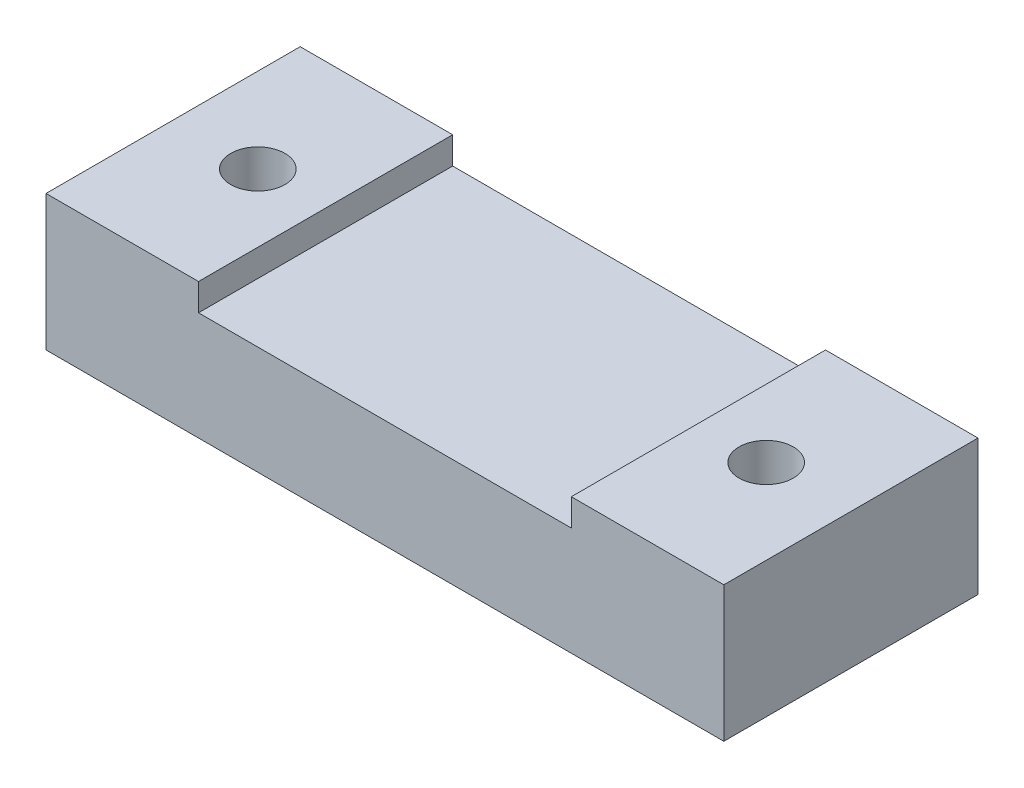
ISO-10303-21;
HEADER;
FILE_DESCRIPTION(('STEP AP214'),'2;1');
FILE_NAME('part.step','',(''),(''),'','','');
FILE_SCHEMA(('AUTOMOTIVE_DESIGN { 1 0 10303 214 1 1 1 1 }'));
ENDSEC;
DATA;
#1=APPLICATION_CONTEXT('core data for automotive mechanical design processes');
#2=APPLICATION_PROTOCOL_DEFINITION('international standard','automotive_design',2000,#1);
#3=PRODUCT_CONTEXT('',#1,'mechanical');
#4=PRODUCT('Part','Part','',(#3));
#5=PRODUCT_RELATED_PRODUCT_CATEGORY('part','',(#4));
#6=PRODUCT_DEFINITION_FORMATION('','',#4);
#7=PRODUCT_DEFINITION_CONTEXT('part definition',#1,'design');
#8=PRODUCT_DEFINITION('design','',#6,#7);
#9=PRODUCT_DEFINITION_SHAPE('','',#8);
#10=(LENGTH_UNIT() NAMED_UNIT(*) SI_UNIT(.MILLI.,.METRE.));
#11=(NAMED_UNIT(*) PLANE_ANGLE_UNIT() SI_UNIT($,.RADIAN.));
#12=(NAMED_UNIT(*) SI_UNIT($,.STERADIAN.) SOLID_ANGLE_UNIT());
#13=UNCERTAINTY_MEASURE_WITH_UNIT(LENGTH_MEASURE(1.E-05),#10,'distance_accuracy_value','');
#14=(GEOMETRIC_REPRESENTATION_CONTEXT(3) GLOBAL_UNCERTAINTY_ASSIGNED_CONTEXT((#13)) GLOBAL_UNIT_ASSIGNED_CONTEXT((#10,
#11,#12)) REPRESENTATION_CONTEXT('',''));
#15=CARTESIAN_POINT('',(0.,0.,0.));
#16=DIRECTION('',(0.,0.,1.));
#17=DIRECTION('',(1.,0.,0.));
#18=AXIS2_PLACEMENT_3D('',#15,#16,#17);
#19=CARTESIAN_POINT('',(-15.,0.,0.));
#20=DIRECTION('',(0.,1.,0.));
#21=DIRECTION('',(0.,0.,1.));
#22=AXIS2_PLACEMENT_3D('',#19,#20,#21);
#23=CYLINDRICAL_SURFACE('',#22,1.6);
#24=CARTESIAN_POINT('',(-15.,8.,0.));
#25=DIRECTION('',(0.,1.,0.));
#26=DIRECTION('',(0.,0.,1.));
#27=AXIS2_PLACEMENT_3D('',#24,#25,#26);
#28=CIRCLE('',#27,1.6);
#29=CARTESIAN_POINT('',(-15.,8.,1.6));
#30=VERTEX_POINT('',#29);
#31=EDGE_CURVE('E304',#30,#30,#28,.T.);
#32=ORIENTED_EDGE('',*,*,#31,.T.);
#33=EDGE_LOOP('',(#32));
#34=FACE_BOUND('',#33,.T.);
#35=CARTESIAN_POINT('',(-15.,3.,0.));
#36=DIRECTION('',(0.,-1.,0.));
#37=DIRECTION('',(0.,0.,-1.));
#38=AXIS2_PLACEMENT_3D('',#35,#36,#37);
#39=CIRCLE('',#38,1.6);
#40=CARTESIAN_POINT('',(-15.,3.,-1.6));
#41=VERTEX_POINT('',#40);
#42=EDGE_CURVE('E224',#41,#41,#39,.F.);
#43=ORIENTED_EDGE('',*,*,#42,.F.);
#44=EDGE_LOOP('',(#43));
#45=FACE_BOUND('',#44,.T.);
#46=ADVANCED_FACE('F36',(#34,#45),#23,.F.);
#47=CARTESIAN_POINT('',(0.,8.,0.));
#48=DIRECTION('',(0.,1.,0.));
#49=DIRECTION('',(0.,0.,1.));
#50=AXIS2_PLACEMENT_3D('',#47,#48,#49);
#51=PLANE('',#50);
#52=DIRECTION('',(0.,0.,-1.));
#53=VECTOR('',#52,1.);
#54=CARTESIAN_POINT('',(11.,8.,-7.5));
#55=LINE('',#54,#53);
#56=CARTESIAN_POINT('',(11.,8.,7.5));
#57=VERTEX_POINT('',#56);
#58=CARTESIAN_POINT('',(11.,8.,-7.5));
#59=VERTEX_POINT('',#58);
#60=EDGE_CURVE('E291',#57,#59,#55,.T.);
#61=ORIENTED_EDGE('',*,*,#60,.F.);
#62=DIRECTION('',(1.,0.,0.));
#63=VECTOR('',#62,1.);
#64=CARTESIAN_POINT('',(-20.,8.,7.5));
#65=LINE('',#64,#63);
#66=CARTESIAN_POINT('',(20.,8.,7.5));
#67=VERTEX_POINT('',#66);
#68=EDGE_CURVE('E320',#57,#67,#65,.T.);
#69=ORIENTED_EDGE('',*,*,#68,.T.);
#70=DIRECTION('',(0.,0.,-1.));
#71=VECTOR('',#70,1.);
#72=CARTESIAN_POINT('',(20.,8.,-7.5));
#73=LINE('',#72,#71);
#74=CARTESIAN_POINT('',(20.,8.,-7.5));
#75=VERTEX_POINT('',#74);
#76=EDGE_CURVE('E310',#67,#75,#73,.T.);
#77=ORIENTED_EDGE('',*,*,#76,.T.);
#78=DIRECTION('',(-1.,0.,0.));
#79=VECTOR('',#78,1.);
#80=CARTESIAN_POINT('',(-20.,8.,-7.5));
#81=LINE('',#80,#79);
#82=EDGE_CURVE('E315',#75,#59,#81,.T.);
#83=ORIENTED_EDGE('',*,*,#82,.T.);
#84=EDGE_LOOP('',(#61,#69,#77,#83));
#85=FACE_BOUND('',#84,.T.);
#86=CARTESIAN_POINT('',(15.,8.,0.));
#87=DIRECTION('',(0.,1.,0.));
#88=DIRECTION('',(0.,0.,1.));
#89=AXIS2_PLACEMENT_3D('',#86,#87,#88);
#90=CIRCLE('',#89,1.6);
#91=CARTESIAN_POINT('',(15.,8.,1.6));
#92=VERTEX_POINT('',#91);
#93=EDGE_CURVE('E296',#92,#92,#90,.T.);
#94=ORIENTED_EDGE('',*,*,#93,.F.);
#95=EDGE_LOOP('',(#94));
#96=FACE_BOUND('',#95,.T.);
#97=ADVANCED_FACE('F362',(#85,#96),#51,.T.);
#98=CARTESIAN_POINT('',(20.,8.,-7.5));
#99=DIRECTION('',(-1.,0.,0.));
#100=DIRECTION('',(0.,0.,1.));
#101=AXIS2_PLACEMENT_3D('',#98,#99,#100);
#102=PLANE('',#101);
#103=DIRECTION('',(0.,0.,-1.));
#104=VECTOR('',#103,1.);
#105=CARTESIAN_POINT('',(20.,0.,-7.5));
#106=LINE('',#105,#104);
#107=CARTESIAN_POINT('',(20.,0.,7.5));
#108=VERTEX_POINT('',#107);
#109=CARTESIAN_POINT('',(20.,0.,-7.5));
#110=VERTEX_POINT('',#109);
#111=EDGE_CURVE('E307',#108,#110,#106,.T.);
#112=ORIENTED_EDGE('',*,*,#111,.T.);
#113=DIRECTION('',(0.,-1.,0.));
#114=VECTOR('',#113,1.);
#115=CARTESIAN_POINT('',(20.,8.,-7.5));
#116=LINE('',#115,#114);
#117=EDGE_CURVE('E11',#75,#110,#116,.T.);
#118=ORIENTED_EDGE('',*,*,#117,.F.);
#119=ORIENTED_EDGE('',*,*,#76,.F.);
#120=DIRECTION('',(0.,-1.,0.));
#121=VECTOR('',#120,1.);
#122=CARTESIAN_POINT('',(20.,8.,7.5));
#123=LINE('',#122,#121);
#124=EDGE_CURVE('E324',#67,#108,#123,.T.);
#125=ORIENTED_EDGE('',*,*,#124,.T.);
#126=EDGE_LOOP('',(#112,#118,#119,#125));
#127=FACE_BOUND('',#126,.T.);
#128=ADVANCED_FACE('F38',(#127),#102,.F.);
#129=CARTESIAN_POINT('',(-20.,8.,-7.5));
#130=DIRECTION('',(0.,0.,1.));
#131=DIRECTION('',(1.,0.,0.));
#132=AXIS2_PLACEMENT_3D('',#129,#130,#131);
#133=PLANE('',#132);
#134=DIRECTION('',(-1.,0.,0.));
#135=VECTOR('',#134,1.);
#136=CARTESIAN_POINT('',(-11.,6.4,-7.5));
#137=LINE('',#136,#135);
#138=CARTESIAN_POINT('',(11.,6.4,-7.5));
#139=VERTEX_POINT('',#138);
#140=CARTESIAN_POINT('',(-11.,6.4,-7.5));
#141=VERTEX_POINT('',#140);
#142=EDGE_CURVE('E280',#139,#141,#137,.T.);
#143=ORIENTED_EDGE('',*,*,#142,.F.);
#144=DIRECTION('',(0.,1.,0.));
#145=VECTOR('',#144,1.);
#146=CARTESIAN_POINT('',(11.,6.4,-7.5));
#147=LINE('',#146,#145);
#148=EDGE_CURVE('E290',#139,#59,#147,.T.);
#149=ORIENTED_EDGE('',*,*,#148,.T.);
#150=ORIENTED_EDGE('',*,*,#82,.F.);
#151=ORIENTED_EDGE('',*,*,#117,.T.);
#152=DIRECTION('',(-1.,0.,0.));
#153=VECTOR('',#152,1.);
#154=CARTESIAN_POINT('',(-20.,0.,-7.5));
#155=LINE('',#154,#153);
#156=CARTESIAN_POINT('',(-20.,0.,-7.5));
#157=VERTEX_POINT('',#156);
#158=EDGE_CURVE('E327',#110,#157,#155,.T.);
#159=ORIENTED_EDGE('',*,*,#158,.T.);
#160=DIRECTION('',(0.,-1.,0.));
#161=VECTOR('',#160,1.);
#162=CARTESIAN_POINT('',(-20.,8.,-7.5));
#163=LINE('',#162,#161);
#164=CARTESIAN_POINT('',(-20.,8.,-7.5));
#165=VERTEX_POINT('',#164);
#166=EDGE_CURVE('E45',#165,#157,#163,.T.);
#167=ORIENTED_EDGE('',*,*,#166,.F.);
#168=CARTESIAN_POINT('',(-11.,8.,-7.5));
#169=VERTEX_POINT('',#168);
#170=EDGE_CURVE('E313',#169,#165,#81,.T.);
#171=ORIENTED_EDGE('',*,*,#170,.F.);
#172=DIRECTION('',(0.,1.,0.));
#173=VECTOR('',#172,1.);
#174=CARTESIAN_POINT('',(-11.,6.4,-7.5));
#175=LINE('',#174,#173);
#176=EDGE_CURVE('E300',#141,#169,#175,.T.);
#177=ORIENTED_EDGE('',*,*,#176,.F.);
#178=EDGE_LOOP('',(#143,#149,#150,#151,#159,#167,#171,#177));
#179=FACE_BOUND('',#178,.T.);
#180=ADVANCED_FACE('F390',(#179),#133,.F.);
#181=CARTESIAN_POINT('',(-20.,8.,-7.5));
#182=DIRECTION('',(1.,0.,0.));
#183=DIRECTION('',(0.,0.,-1.));
#184=AXIS2_PLACEMENT_3D('',#181,#182,#183);
#185=PLANE('',#184);
#186=DIRECTION('',(0.,0.,1.));
#187=VECTOR('',#186,1.);
#188=CARTESIAN_POINT('',(-20.,0.,-7.5));
#189=LINE('',#188,#187);
#190=CARTESIAN_POINT('',(-20.,0.,7.5));
#191=VERTEX_POINT('',#190);
#192=EDGE_CURVE('E329',#157,#191,#189,.T.);
#193=ORIENTED_EDGE('',*,*,#192,.T.);
#194=DIRECTION('',(0.,-1.,0.));
#195=VECTOR('',#194,1.);
#196=CARTESIAN_POINT('',(-20.,8.,7.5));
#197=LINE('',#196,#195);
#198=CARTESIAN_POINT('',(-20.,8.,7.5));
#199=VERTEX_POINT('',#198);
#200=EDGE_CURVE('E334',#199,#191,#197,.T.);
#201=ORIENTED_EDGE('',*,*,#200,.F.);
#202=DIRECTION('',(0.,0.,1.));
#203=VECTOR('',#202,1.);
#204=CARTESIAN_POINT('',(-20.,8.,-7.5));
#205=LINE('',#204,#203);
#206=EDGE_CURVE('E318',#165,#199,#205,.T.);
#207=ORIENTED_EDGE('',*,*,#206,.F.);
#208=ORIENTED_EDGE('',*,*,#166,.T.);
#209=EDGE_LOOP('',(#193,#201,#207,#208));
#210=FACE_BOUND('',#209,.T.);
#211=ADVANCED_FACE('F387',(#210),#185,.F.);
#212=CARTESIAN_POINT('',(-20.,8.,7.5));
#213=DIRECTION('',(0.,0.,-1.));
#214=DIRECTION('',(-1.,0.,0.));
#215=AXIS2_PLACEMENT_3D('',#212,#213,#214);
#216=PLANE('',#215);
#217=ORIENTED_EDGE('',*,*,#68,.F.);
#218=DIRECTION('',(0.,1.,0.));
#219=VECTOR('',#218,1.);
#220=CARTESIAN_POINT('',(11.,6.4,7.5));
#221=LINE('',#220,#219);
#222=CARTESIAN_POINT('',(11.,6.4,7.5));
#223=VERTEX_POINT('',#222);
#224=EDGE_CURVE('E294',#223,#57,#221,.T.);
#225=ORIENTED_EDGE('',*,*,#224,.F.);
#226=DIRECTION('',(1.,0.,0.));
#227=VECTOR('',#226,1.);
#228=CARTESIAN_POINT('',(-11.,6.4,7.5));
#229=LINE('',#228,#227);
#230=CARTESIAN_POINT('',(-11.,6.4,7.5));
#231=VERTEX_POINT('',#230);
#232=EDGE_CURVE('E287',#231,#223,#229,.T.);
#233=ORIENTED_EDGE('',*,*,#232,.F.);
#234=DIRECTION('',(0.,1.,0.));
#235=VECTOR('',#234,1.);
#236=CARTESIAN_POINT('',(-11.,6.4,7.5));
#237=LINE('',#236,#235);
#238=CARTESIAN_POINT('',(-11.,8.,7.5));
#239=VERTEX_POINT('',#238);
#240=EDGE_CURVE('E297',#231,#239,#237,.T.);
#241=ORIENTED_EDGE('',*,*,#240,.T.);
#242=EDGE_CURVE('E321',#199,#239,#65,.T.);
#243=ORIENTED_EDGE('',*,*,#242,.F.);
#244=ORIENTED_EDGE('',*,*,#200,.T.);
#245=DIRECTION('',(1.,0.,0.));
#246=VECTOR('',#245,1.);
#247=CARTESIAN_POINT('',(-20.,0.,7.5));
#248=LINE('',#247,#246);
#249=EDGE_CURVE('E314',#191,#108,#248,.T.);
#250=ORIENTED_EDGE('',*,*,#249,.T.);
#251=ORIENTED_EDGE('',*,*,#124,.F.);
#252=EDGE_LOOP('',(#217,#225,#233,#241,#243,#244,#250,#251));
#253=FACE_BOUND('',#252,.T.);
#254=ADVANCED_FACE('F380',(#253),#216,.F.);
#255=DIRECTION('',(0.,0.,1.));
#256=VECTOR('',#255,1.);
#257=CARTESIAN_POINT('',(-11.,8.,-7.5));
#258=LINE('',#257,#256);
#259=EDGE_CURVE('E281',#169,#239,#258,.T.);
#260=ORIENTED_EDGE('',*,*,#259,.F.);
#261=ORIENTED_EDGE('',*,*,#170,.T.);
#262=ORIENTED_EDGE('',*,*,#206,.T.);
#263=ORIENTED_EDGE('',*,*,#242,.T.);
#264=EDGE_LOOP('',(#260,#261,#262,#263));
#265=FACE_BOUND('',#264,.T.);
#266=ORIENTED_EDGE('',*,*,#31,.F.);
#267=EDGE_LOOP('',(#266));
#268=FACE_BOUND('',#267,.T.);
#269=ADVANCED_FACE('F370',(#265,#268),#51,.T.);
#270=CARTESIAN_POINT('',(0.,0.,0.));
#271=DIRECTION('',(0.,1.,0.));
#272=DIRECTION('',(0.,0.,1.));
#273=AXIS2_PLACEMENT_3D('',#270,#271,#272);
#274=PLANE('',#273);
#275=DIRECTION('',(-0.866025403784439,0.,0.5));
#276=VECTOR('',#275,1.);
#277=CARTESIAN_POINT('',(-12.,0.,1.73205080756888));
#278=LINE('',#277,#276);
#279=CARTESIAN_POINT('',(-12.,0.,1.73205080756888));
#280=VERTEX_POINT('',#279);
#281=CARTESIAN_POINT('',(-15.,0.,3.46410161513775));
#282=VERTEX_POINT('',#281);
#283=EDGE_CURVE('E211',#280,#282,#278,.T.);
#284=ORIENTED_EDGE('',*,*,#283,.F.);
#285=DIRECTION('',(0.,0.,1.));
#286=VECTOR('',#285,1.);
#287=CARTESIAN_POINT('',(-12.,0.,-1.73205080756888));
#288=LINE('',#287,#286);
#289=CARTESIAN_POINT('',(-12.,0.,-1.73205080756888));
#290=VERTEX_POINT('',#289);
#291=EDGE_CURVE('E53',#290,#280,#288,.T.);
#292=ORIENTED_EDGE('',*,*,#291,.F.);
#293=DIRECTION('',(0.866025403784439,0.,0.5));
#294=VECTOR('',#293,1.);
#295=CARTESIAN_POINT('',(-15.,0.,-3.46410161513776));
#296=LINE('',#295,#294);
#297=CARTESIAN_POINT('',(-15.,0.,-3.46410161513776));
#298=VERTEX_POINT('',#297);
#299=EDGE_CURVE('E197',#298,#290,#296,.T.);
#300=ORIENTED_EDGE('',*,*,#299,.F.);
#301=DIRECTION('',(0.866025403784438,0.,-0.5));
#302=VECTOR('',#301,1.);
#303=CARTESIAN_POINT('',(-18.,0.,-1.73205080756888));
#304=LINE('',#303,#302);
#305=CARTESIAN_POINT('',(-18.,0.,-1.73205080756888));
#306=VERTEX_POINT('',#305);
#307=EDGE_CURVE('E200',#306,#298,#304,.T.);
#308=ORIENTED_EDGE('',*,*,#307,.F.);
#309=DIRECTION('',(0.,0.,-1.));
#310=VECTOR('',#309,1.);
#311=CARTESIAN_POINT('',(-18.,0.,1.73205080756888));
#312=LINE('',#311,#310);
#313=CARTESIAN_POINT('',(-18.,0.,1.73205080756888));
#314=VERTEX_POINT('',#313);
#315=EDGE_CURVE('E217',#314,#306,#312,.T.);
#316=ORIENTED_EDGE('',*,*,#315,.F.);
#317=DIRECTION('',(-0.866025403784439,0.,-0.5));
#318=VECTOR('',#317,1.);
#319=CARTESIAN_POINT('',(-15.,0.,3.46410161513775));
#320=LINE('',#319,#318);
#321=EDGE_CURVE('E214',#282,#314,#320,.T.);
#322=ORIENTED_EDGE('',*,*,#321,.F.);
#323=EDGE_LOOP('',(#284,#292,#300,#308,#316,#322));
#324=FACE_BOUND('',#323,.T.);
#325=DIRECTION('',(0.866025403784438,0.,0.5));
#326=VECTOR('',#325,1.);
#327=CARTESIAN_POINT('',(18.,0.,-1.73205080756888));
#328=LINE('',#327,#326);
#329=CARTESIAN_POINT('',(15.,0.,-3.46410161513776));
#330=VERTEX_POINT('',#329);
#331=CARTESIAN_POINT('',(18.,0.,-1.73205080756888));
#332=VERTEX_POINT('',#331);
#333=EDGE_CURVE('E253',#330,#332,#328,.T.);
#334=ORIENTED_EDGE('',*,*,#333,.F.);
#335=DIRECTION('',(0.866025403784439,0.,-0.5));
#336=VECTOR('',#335,1.);
#337=CARTESIAN_POINT('',(15.,0.,-3.46410161513776));
#338=LINE('',#337,#336);
#339=CARTESIAN_POINT('',(12.,0.,-1.73205080756888));
#340=VERTEX_POINT('',#339);
#341=EDGE_CURVE('E61',#340,#330,#338,.T.);
#342=ORIENTED_EDGE('',*,*,#341,.F.);
#343=DIRECTION('',(0.,0.,-1.));
#344=VECTOR('',#343,1.);
#345=CARTESIAN_POINT('',(12.,0.,-1.73205080756888));
#346=LINE('',#345,#344);
#347=CARTESIAN_POINT('',(12.,0.,1.73205080756888));
#348=VERTEX_POINT('',#347);
#349=EDGE_CURVE('E236',#348,#340,#346,.T.);
#350=ORIENTED_EDGE('',*,*,#349,.F.);
#351=DIRECTION('',(-0.866025403784439,0.,-0.5));
#352=VECTOR('',#351,1.);
#353=CARTESIAN_POINT('',(12.,0.,1.73205080756888));
#354=LINE('',#353,#352);
#355=CARTESIAN_POINT('',(15.,0.,3.46410161513775));
#356=VERTEX_POINT('',#355);
#357=EDGE_CURVE('E262',#356,#348,#354,.T.);
#358=ORIENTED_EDGE('',*,*,#357,.F.);
#359=DIRECTION('',(-0.866025403784439,0.,0.5));
#360=VECTOR('',#359,1.);
#361=CARTESIAN_POINT('',(15.,0.,3.46410161513775));
#362=LINE('',#361,#360);
#363=CARTESIAN_POINT('',(18.,0.,1.73205080756888));
#364=VERTEX_POINT('',#363);
#365=EDGE_CURVE('E259',#364,#356,#362,.T.);
#366=ORIENTED_EDGE('',*,*,#365,.F.);
#367=DIRECTION('',(0.,0.,1.));
#368=VECTOR('',#367,1.);
#369=CARTESIAN_POINT('',(18.,0.,1.73205080756888));
#370=LINE('',#369,#368);
#371=EDGE_CURVE('E256',#332,#364,#370,.T.);
#372=ORIENTED_EDGE('',*,*,#371,.F.);
#373=EDGE_LOOP('',(#334,#342,#350,#358,#366,#372));
#374=FACE_BOUND('',#373,.T.);
#375=ORIENTED_EDGE('',*,*,#111,.F.);
#376=ORIENTED_EDGE('',*,*,#249,.F.);
#377=ORIENTED_EDGE('',*,*,#192,.F.);
#378=ORIENTED_EDGE('',*,*,#158,.F.);
#379=EDGE_LOOP('',(#375,#376,#377,#378));
#380=FACE_BOUND('',#379,.T.);
#381=ADVANCED_FACE('F377',(#324,#374,#380),#274,.F.);
#382=CARTESIAN_POINT('',(15.,0.,0.));
#383=DIRECTION('',(0.,1.,0.));
#384=DIRECTION('',(0.,0.,1.));
#385=AXIS2_PLACEMENT_3D('',#382,#383,#384);
#386=CYLINDRICAL_SURFACE('',#385,1.6);
#387=CARTESIAN_POINT('',(15.,3.,0.));
#388=DIRECTION('',(0.,1.,0.));
#389=DIRECTION('',(0.,0.,1.));
#390=AXIS2_PLACEMENT_3D('',#387,#388,#389);
#391=CIRCLE('',#390,1.6);
#392=CARTESIAN_POINT('',(15.,3.,1.6));
#393=VERTEX_POINT('',#392);
#394=EDGE_CURVE('E40',#393,#393,#391,.F.);
#395=ORIENTED_EDGE('',*,*,#394,.T.);
#396=EDGE_LOOP('',(#395));
#397=FACE_BOUND('',#396,.T.);
#398=ORIENTED_EDGE('',*,*,#93,.T.);
#399=EDGE_LOOP('',(#398));
#400=FACE_BOUND('',#399,.T.);
#401=ADVANCED_FACE('F343',(#397,#400),#386,.F.);
#402=CARTESIAN_POINT('',(11.,6.4,-7.5));
#403=DIRECTION('',(1.,0.,0.));
#404=DIRECTION('',(0.,0.,-1.));
#405=AXIS2_PLACEMENT_3D('',#402,#403,#404);
#406=PLANE('',#405);
#407=ORIENTED_EDGE('',*,*,#60,.T.);
#408=ORIENTED_EDGE('',*,*,#148,.F.);
#409=DIRECTION('',(0.,0.,-1.));
#410=VECTOR('',#409,1.);
#411=CARTESIAN_POINT('',(11.,6.4,-7.5));
#412=LINE('',#411,#410);
#413=EDGE_CURVE('E277',#223,#139,#412,.T.);
#414=ORIENTED_EDGE('',*,*,#413,.F.);
#415=ORIENTED_EDGE('',*,*,#224,.T.);
#416=EDGE_LOOP('',(#407,#408,#414,#415));
#417=FACE_BOUND('',#416,.T.);
#418=ADVANCED_FACE('F374',(#417),#406,.F.);
#419=CARTESIAN_POINT('',(-11.,6.4,-7.5));
#420=DIRECTION('',(-1.,0.,0.));
#421=DIRECTION('',(0.,0.,1.));
#422=AXIS2_PLACEMENT_3D('',#419,#420,#421);
#423=PLANE('',#422);
#424=ORIENTED_EDGE('',*,*,#259,.T.);
#425=ORIENTED_EDGE('',*,*,#240,.F.);
#426=DIRECTION('',(0.,0.,1.));
#427=VECTOR('',#426,1.);
#428=CARTESIAN_POINT('',(-11.,6.4,-7.5));
#429=LINE('',#428,#427);
#430=EDGE_CURVE('E284',#141,#231,#429,.T.);
#431=ORIENTED_EDGE('',*,*,#430,.F.);
#432=ORIENTED_EDGE('',*,*,#176,.T.);
#433=EDGE_LOOP('',(#424,#425,#431,#432));
#434=FACE_BOUND('',#433,.T.);
#435=ADVANCED_FACE('F423',(#434),#423,.F.);
#436=CARTESIAN_POINT('',(0.,6.4,0.));
#437=DIRECTION('',(0.,1.,0.));
#438=DIRECTION('',(0.,0.,1.));
#439=AXIS2_PLACEMENT_3D('',#436,#437,#438);
#440=PLANE('',#439);
#441=ORIENTED_EDGE('',*,*,#413,.T.);
#442=ORIENTED_EDGE('',*,*,#142,.T.);
#443=ORIENTED_EDGE('',*,*,#430,.T.);
#444=ORIENTED_EDGE('',*,*,#232,.T.);
#445=EDGE_LOOP('',(#441,#442,#443,#444));
#446=FACE_BOUND('',#445,.T.);
#447=ADVANCED_FACE('F402',(#446),#440,.T.);
#448=CARTESIAN_POINT('',(0.,3.,0.));
#449=DIRECTION('',(0.,-1.,0.));
#450=DIRECTION('',(0.,0.,-1.));
#451=AXIS2_PLACEMENT_3D('',#448,#449,#450);
#452=PLANE('',#451);
#453=DIRECTION('',(0.,0.,1.));
#454=VECTOR('',#453,1.);
#455=CARTESIAN_POINT('',(-12.,3.,-1.73205080756888));
#456=LINE('',#455,#454);
#457=CARTESIAN_POINT('',(-12.,3.,-1.73205080756888));
#458=VERTEX_POINT('',#457);
#459=CARTESIAN_POINT('',(-12.,3.,1.73205080756888));
#460=VERTEX_POINT('',#459);
#461=EDGE_CURVE('E177',#458,#460,#456,.T.);
#462=ORIENTED_EDGE('',*,*,#461,.T.);
#463=DIRECTION('',(-0.866025403784439,0.,0.5));
#464=VECTOR('',#463,1.);
#465=CARTESIAN_POINT('',(-12.,3.,1.73205080756888));
#466=LINE('',#465,#464);
#467=CARTESIAN_POINT('',(-15.,3.,3.46410161513775));
#468=VERTEX_POINT('',#467);
#469=EDGE_CURVE('E186',#460,#468,#466,.T.);
#470=ORIENTED_EDGE('',*,*,#469,.T.);
#471=DIRECTION('',(-0.866025403784439,0.,-0.5));
#472=VECTOR('',#471,1.);
#473=CARTESIAN_POINT('',(-15.,3.,3.46410161513775));
#474=LINE('',#473,#472);
#475=CARTESIAN_POINT('',(-18.,3.,1.73205080756888));
#476=VERTEX_POINT('',#475);
#477=EDGE_CURVE('E191',#468,#476,#474,.T.);
#478=ORIENTED_EDGE('',*,*,#477,.T.);
#479=DIRECTION('',(0.,0.,-1.));
#480=VECTOR('',#479,1.);
#481=CARTESIAN_POINT('',(-18.,3.,1.73205080756888));
#482=LINE('',#481,#480);
#483=CARTESIAN_POINT('',(-18.,3.,-1.73205080756888));
#484=VERTEX_POINT('',#483);
#485=EDGE_CURVE('E204',#476,#484,#482,.T.);
#486=ORIENTED_EDGE('',*,*,#485,.T.);
#487=DIRECTION('',(0.866025403784438,0.,-0.5));
#488=VECTOR('',#487,1.);
#489=CARTESIAN_POINT('',(-18.,3.,-1.73205080756888));
#490=LINE('',#489,#488);
#491=CARTESIAN_POINT('',(-15.,3.,-3.46410161513776));
#492=VERTEX_POINT('',#491);
#493=EDGE_CURVE('E207',#484,#492,#490,.T.);
#494=ORIENTED_EDGE('',*,*,#493,.T.);
#495=DIRECTION('',(0.866025403784439,0.,0.5));
#496=VECTOR('',#495,1.);
#497=CARTESIAN_POINT('',(-15.,3.,-3.46410161513776));
#498=LINE('',#497,#496);
#499=EDGE_CURVE('E183',#492,#458,#498,.T.);
#500=ORIENTED_EDGE('',*,*,#499,.T.);
#501=EDGE_LOOP('',(#462,#470,#478,#486,#494,#500));
#502=FACE_BOUND('',#501,.T.);
#503=ORIENTED_EDGE('',*,*,#42,.T.);
#504=EDGE_LOOP('',(#503));
#505=FACE_BOUND('',#504,.T.);
#506=ADVANCED_FACE('F193',(#502,#505),#452,.T.);
#507=CARTESIAN_POINT('',(-12.,3.,-1.73205080756888));
#508=DIRECTION('',(1.,0.,0.));
#509=DIRECTION('',(0.,0.,-1.));
#510=AXIS2_PLACEMENT_3D('',#507,#508,#509);
#511=PLANE('',#510);
#512=ORIENTED_EDGE('',*,*,#291,.T.);
#513=DIRECTION('',(0.,-1.,0.));
#514=VECTOR('',#513,1.);
#515=CARTESIAN_POINT('',(-12.,3.,1.73205080756888));
#516=LINE('',#515,#514);
#517=EDGE_CURVE('E173',#460,#280,#516,.T.);
#518=ORIENTED_EDGE('',*,*,#517,.F.);
#519=ORIENTED_EDGE('',*,*,#461,.F.);
#520=DIRECTION('',(0.,-1.,0.));
#521=VECTOR('',#520,1.);
#522=CARTESIAN_POINT('',(-12.,3.,-1.73205080756888));
#523=LINE('',#522,#521);
#524=EDGE_CURVE('E222',#458,#290,#523,.T.);
#525=ORIENTED_EDGE('',*,*,#524,.T.);
#526=EDGE_LOOP('',(#512,#518,#519,#525));
#527=FACE_BOUND('',#526,.T.);
#528=ADVANCED_FACE('F175',(#527),#511,.F.);
#529=CARTESIAN_POINT('',(-15.,3.,-3.46410161513776));
#530=DIRECTION('',(0.5,0.,-0.866025403784439));
#531=DIRECTION('',(-0.866025403784439,0.,-0.5));
#532=AXIS2_PLACEMENT_3D('',#529,#530,#531);
#533=PLANE('',#532);
#534=ORIENTED_EDGE('',*,*,#299,.T.);
#535=ORIENTED_EDGE('',*,*,#524,.F.);
#536=ORIENTED_EDGE('',*,*,#499,.F.);
#537=DIRECTION('',(0.,-1.,0.));
#538=VECTOR('',#537,1.);
#539=CARTESIAN_POINT('',(-15.,3.,-3.46410161513776));
#540=LINE('',#539,#538);
#541=EDGE_CURVE('E225',#492,#298,#540,.T.);
#542=ORIENTED_EDGE('',*,*,#541,.T.);
#543=EDGE_LOOP('',(#534,#535,#536,#542));
#544=FACE_BOUND('',#543,.T.);
#545=ADVANCED_FACE('F550',(#544),#533,.F.);
#546=CARTESIAN_POINT('',(-18.,3.,-1.73205080756888));
#547=DIRECTION('',(-0.5,0.,-0.866025403784438));
#548=DIRECTION('',(-0.866025403784439,0.,0.5));
#549=AXIS2_PLACEMENT_3D('',#546,#547,#548);
#550=PLANE('',#549);
#551=ORIENTED_EDGE('',*,*,#307,.T.);
#552=ORIENTED_EDGE('',*,*,#541,.F.);
#553=ORIENTED_EDGE('',*,*,#493,.F.);
#554=DIRECTION('',(0.,-1.,0.));
#555=VECTOR('',#554,1.);
#556=CARTESIAN_POINT('',(-18.,3.,-1.73205080756888));
#557=LINE('',#556,#555);
#558=EDGE_CURVE('E227',#484,#306,#557,.T.);
#559=ORIENTED_EDGE('',*,*,#558,.T.);
#560=EDGE_LOOP('',(#551,#552,#553,#559));
#561=FACE_BOUND('',#560,.T.);
#562=ADVANCED_FACE('F539',(#561),#550,.F.);
#563=CARTESIAN_POINT('',(-18.,3.,1.73205080756888));
#564=DIRECTION('',(-1.,0.,0.));
#565=DIRECTION('',(0.,0.,1.));
#566=AXIS2_PLACEMENT_3D('',#563,#564,#565);
#567=PLANE('',#566);
#568=ORIENTED_EDGE('',*,*,#315,.T.);
#569=ORIENTED_EDGE('',*,*,#558,.F.);
#570=ORIENTED_EDGE('',*,*,#485,.F.);
#571=DIRECTION('',(0.,-1.,0.));
#572=VECTOR('',#571,1.);
#573=CARTESIAN_POINT('',(-18.,3.,1.73205080756888));
#574=LINE('',#573,#572);
#575=EDGE_CURVE('E229',#476,#314,#574,.T.);
#576=ORIENTED_EDGE('',*,*,#575,.T.);
#577=EDGE_LOOP('',(#568,#569,#570,#576));
#578=FACE_BOUND('',#577,.T.);
#579=ADVANCED_FACE('F528',(#578),#567,.F.);
#580=CARTESIAN_POINT('',(-15.,3.,3.46410161513775));
#581=DIRECTION('',(-0.5,0.,0.866025403784439));
#582=DIRECTION('',(0.866025403784439,0.,0.5));
#583=AXIS2_PLACEMENT_3D('',#580,#581,#582);
#584=PLANE('',#583);
#585=ORIENTED_EDGE('',*,*,#321,.T.);
#586=ORIENTED_EDGE('',*,*,#575,.F.);
#587=ORIENTED_EDGE('',*,*,#477,.F.);
#588=DIRECTION('',(0.,-1.,0.));
#589=VECTOR('',#588,1.);
#590=CARTESIAN_POINT('',(-15.,3.,3.46410161513775));
#591=LINE('',#590,#589);
#592=EDGE_CURVE('E182',#468,#282,#591,.T.);
#593=ORIENTED_EDGE('',*,*,#592,.T.);
#594=EDGE_LOOP('',(#585,#586,#587,#593));
#595=FACE_BOUND('',#594,.T.);
#596=ADVANCED_FACE('F357',(#595),#584,.F.);
#597=CARTESIAN_POINT('',(-12.,3.,1.73205080756888));
#598=DIRECTION('',(0.5,0.,0.866025403784438));
#599=DIRECTION('',(0.866025403784439,0.,-0.5));
#600=AXIS2_PLACEMENT_3D('',#597,#598,#599);
#601=PLANE('',#600);
#602=ORIENTED_EDGE('',*,*,#283,.T.);
#603=ORIENTED_EDGE('',*,*,#592,.F.);
#604=ORIENTED_EDGE('',*,*,#469,.F.);
#605=ORIENTED_EDGE('',*,*,#517,.T.);
#606=EDGE_LOOP('',(#602,#603,#604,#605));
#607=FACE_BOUND('',#606,.T.);
#608=ADVANCED_FACE('F187',(#607),#601,.F.);
#609=CARTESIAN_POINT('',(0.,3.,0.));
#610=DIRECTION('',(0.,1.,0.));
#611=DIRECTION('',(0.,0.,1.));
#612=AXIS2_PLACEMENT_3D('',#609,#610,#611);
#613=PLANE('',#612);
#614=DIRECTION('',(0.866025403784439,0.,-0.5));
#615=VECTOR('',#614,1.);
#616=CARTESIAN_POINT('',(15.,3.,-3.46410161513776));
#617=LINE('',#616,#615);
#618=CARTESIAN_POINT('',(12.,3.,-1.73205080756888));
#619=VERTEX_POINT('',#618);
#620=CARTESIAN_POINT('',(15.,3.,-3.46410161513776));
#621=VERTEX_POINT('',#620);
#622=EDGE_CURVE('E232',#619,#621,#617,.T.);
#623=ORIENTED_EDGE('',*,*,#622,.T.);
#624=DIRECTION('',(0.866025403784438,0.,0.5));
#625=VECTOR('',#624,1.);
#626=CARTESIAN_POINT('',(18.,3.,-1.73205080756888));
#627=LINE('',#626,#625);
#628=CARTESIAN_POINT('',(18.,3.,-1.73205080756888));
#629=VERTEX_POINT('',#628);
#630=EDGE_CURVE('E235',#621,#629,#627,.T.);
#631=ORIENTED_EDGE('',*,*,#630,.T.);
#632=DIRECTION('',(0.,0.,1.));
#633=VECTOR('',#632,1.);
#634=CARTESIAN_POINT('',(18.,3.,1.73205080756888));
#635=LINE('',#634,#633);
#636=CARTESIAN_POINT('',(18.,3.,1.73205080756888));
#637=VERTEX_POINT('',#636);
#638=EDGE_CURVE('E239',#629,#637,#635,.T.);
#639=ORIENTED_EDGE('',*,*,#638,.T.);
#640=DIRECTION('',(-0.866025403784439,0.,0.5));
#641=VECTOR('',#640,1.);
#642=CARTESIAN_POINT('',(15.,3.,3.46410161513775));
#643=LINE('',#642,#641);
#644=CARTESIAN_POINT('',(15.,3.,3.46410161513775));
#645=VERTEX_POINT('',#644);
#646=EDGE_CURVE('E242',#637,#645,#643,.T.);
#647=ORIENTED_EDGE('',*,*,#646,.T.);
#648=DIRECTION('',(-0.866025403784439,0.,-0.5));
#649=VECTOR('',#648,1.);
#650=CARTESIAN_POINT('',(12.,3.,1.73205080756888));
#651=LINE('',#650,#649);
#652=CARTESIAN_POINT('',(12.,3.,1.73205080756888));
#653=VERTEX_POINT('',#652);
#654=EDGE_CURVE('E245',#645,#653,#651,.T.);
#655=ORIENTED_EDGE('',*,*,#654,.T.);
#656=DIRECTION('',(0.,0.,-1.));
#657=VECTOR('',#656,1.);
#658=CARTESIAN_POINT('',(12.,3.,-1.73205080756888));
#659=LINE('',#658,#657);
#660=EDGE_CURVE('E248',#653,#619,#659,.T.);
#661=ORIENTED_EDGE('',*,*,#660,.T.);
#662=EDGE_LOOP('',(#623,#631,#639,#647,#655,#661));
#663=FACE_BOUND('',#662,.T.);
#664=ORIENTED_EDGE('',*,*,#394,.F.);
#665=EDGE_LOOP('',(#664));
#666=FACE_BOUND('',#665,.T.);
#667=ADVANCED_FACE('F346',(#663,#666),#613,.F.);
#668=CARTESIAN_POINT('',(15.,3.,-3.46410161513776));
#669=DIRECTION('',(-0.5,0.,-0.866025403784439));
#670=DIRECTION('',(-0.866025403784439,0.,0.5));
#671=AXIS2_PLACEMENT_3D('',#668,#669,#670);
#672=PLANE('',#671);
#673=ORIENTED_EDGE('',*,*,#341,.T.);
#674=DIRECTION('',(0.,-1.,0.));
#675=VECTOR('',#674,1.);
#676=CARTESIAN_POINT('',(15.,3.,-3.46410161513776));
#677=LINE('',#676,#675);
#678=EDGE_CURVE('E251',#621,#330,#677,.T.);
#679=ORIENTED_EDGE('',*,*,#678,.F.);
#680=ORIENTED_EDGE('',*,*,#622,.F.);
#681=DIRECTION('',(0.,-1.,0.));
#682=VECTOR('',#681,1.);
#683=CARTESIAN_POINT('',(12.,3.,-1.73205080756888));
#684=LINE('',#683,#682);
#685=EDGE_CURVE('E212',#619,#340,#684,.T.);
#686=ORIENTED_EDGE('',*,*,#685,.T.);
#687=EDGE_LOOP('',(#673,#679,#680,#686));
#688=FACE_BOUND('',#687,.T.);
#689=ADVANCED_FACE('F348',(#688),#672,.F.);
#690=CARTESIAN_POINT('',(12.,3.,-1.73205080756888));
#691=DIRECTION('',(-1.,0.,0.));
#692=DIRECTION('',(0.,0.,1.));
#693=AXIS2_PLACEMENT_3D('',#690,#691,#692);
#694=PLANE('',#693);
#695=ORIENTED_EDGE('',*,*,#349,.T.);
#696=ORIENTED_EDGE('',*,*,#685,.F.);
#697=ORIENTED_EDGE('',*,*,#660,.F.);
#698=DIRECTION('',(0.,-1.,0.));
#699=VECTOR('',#698,1.);
#700=CARTESIAN_POINT('',(12.,3.,1.73205080756888));
#701=LINE('',#700,#699);
#702=EDGE_CURVE('E268',#653,#348,#701,.T.);
#703=ORIENTED_EDGE('',*,*,#702,.T.);
#704=EDGE_LOOP('',(#695,#696,#697,#703));
#705=FACE_BOUND('',#704,.T.);
#706=ADVANCED_FACE('F355',(#705),#694,.F.);
#707=CARTESIAN_POINT('',(12.,3.,1.73205080756888));
#708=DIRECTION('',(-0.5,0.,0.866025403784438));
#709=DIRECTION('',(0.866025403784439,0.,0.5));
#710=AXIS2_PLACEMENT_3D('',#707,#708,#709);
#711=PLANE('',#710);
#712=ORIENTED_EDGE('',*,*,#357,.T.);
#713=ORIENTED_EDGE('',*,*,#702,.F.);
#714=ORIENTED_EDGE('',*,*,#654,.F.);
#715=DIRECTION('',(0.,-1.,0.));
#716=VECTOR('',#715,1.);
#717=CARTESIAN_POINT('',(15.,3.,3.46410161513775));
#718=LINE('',#717,#716);
#719=EDGE_CURVE('E270',#645,#356,#718,.T.);
#720=ORIENTED_EDGE('',*,*,#719,.T.);
#721=EDGE_LOOP('',(#712,#713,#714,#720));
#722=FACE_BOUND('',#721,.T.);
#723=ADVANCED_FACE('F442',(#722),#711,.F.);
#724=CARTESIAN_POINT('',(15.,3.,3.46410161513775));
#725=DIRECTION('',(0.5,0.,0.866025403784439));
#726=DIRECTION('',(0.866025403784439,0.,-0.5));
#727=AXIS2_PLACEMENT_3D('',#724,#725,#726);
#728=PLANE('',#727);
#729=ORIENTED_EDGE('',*,*,#365,.T.);
#730=ORIENTED_EDGE('',*,*,#719,.F.);
#731=ORIENTED_EDGE('',*,*,#646,.F.);
#732=DIRECTION('',(0.,-1.,0.));
#733=VECTOR('',#732,1.);
#734=CARTESIAN_POINT('',(18.,3.,1.73205080756888));
#735=LINE('',#734,#733);
#736=EDGE_CURVE('E272',#637,#364,#735,.T.);
#737=ORIENTED_EDGE('',*,*,#736,.T.);
#738=EDGE_LOOP('',(#729,#730,#731,#737));
#739=FACE_BOUND('',#738,.T.);
#740=ADVANCED_FACE('F438',(#739),#728,.F.);
#741=CARTESIAN_POINT('',(18.,3.,1.73205080756888));
#742=DIRECTION('',(1.,0.,0.));
#743=DIRECTION('',(0.,0.,-1.));
#744=AXIS2_PLACEMENT_3D('',#741,#742,#743);
#745=PLANE('',#744);
#746=ORIENTED_EDGE('',*,*,#371,.T.);
#747=ORIENTED_EDGE('',*,*,#736,.F.);
#748=ORIENTED_EDGE('',*,*,#638,.F.);
#749=DIRECTION('',(0.,-1.,0.));
#750=VECTOR('',#749,1.);
#751=CARTESIAN_POINT('',(18.,3.,-1.73205080756888));
#752=LINE('',#751,#750);
#753=EDGE_CURVE('E274',#629,#332,#752,.T.);
#754=ORIENTED_EDGE('',*,*,#753,.T.);
#755=EDGE_LOOP('',(#746,#747,#748,#754));
#756=FACE_BOUND('',#755,.T.);
#757=ADVANCED_FACE('F434',(#756),#745,.F.);
#758=CARTESIAN_POINT('',(18.,3.,-1.73205080756888));
#759=DIRECTION('',(0.5,0.,-0.866025403784438));
#760=DIRECTION('',(-0.866025403784439,0.,-0.5));
#761=AXIS2_PLACEMENT_3D('',#758,#759,#760);
#762=PLANE('',#761);
#763=ORIENTED_EDGE('',*,*,#333,.T.);
#764=ORIENTED_EDGE('',*,*,#753,.F.);
#765=ORIENTED_EDGE('',*,*,#630,.F.);
#766=ORIENTED_EDGE('',*,*,#678,.T.);
#767=EDGE_LOOP('',(#763,#764,#765,#766));
#768=FACE_BOUND('',#767,.T.);
#769=ADVANCED_FACE('F431',(#768),#762,.F.);
#770=CLOSED_SHELL('',(#46,#97,#128,#180,#211,#254,#269,#381,#401,#418,#435,#447,#506,#528,#545,
#562,#579,#596,#608,#667,#689,#706,#723,#740,#757,#769));
#771=MANIFOLD_SOLID_BREP('B2',#770);
#772=ADVANCED_BREP_SHAPE_REPRESENTATION('',(#18,#771),#14);
#773=SHAPE_DEFINITION_REPRESENTATION(#9,#772);
ENDSEC;
END-ISO-10303-21;
